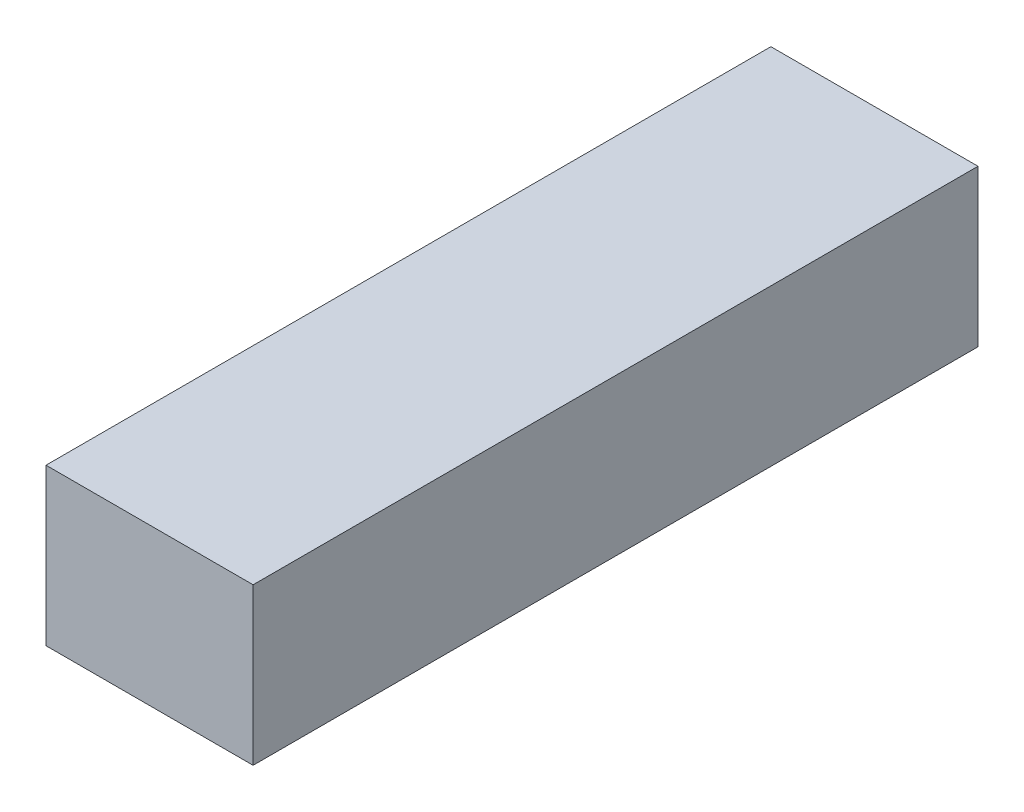
ISO-10303-21;
HEADER;
FILE_DESCRIPTION(('STEP AP214'),'2;1');
FILE_NAME('part.step','',(''),(''),'','','');
FILE_SCHEMA(('AUTOMOTIVE_DESIGN { 1 0 10303 214 1 1 1 1 }'));
ENDSEC;
DATA;
#1=APPLICATION_CONTEXT('core data for automotive mechanical design processes');
#2=APPLICATION_PROTOCOL_DEFINITION('international standard','automotive_design',2000,#1);
#3=PRODUCT_CONTEXT('',#1,'mechanical');
#4=PRODUCT('Part','Part','',(#3));
#5=PRODUCT_RELATED_PRODUCT_CATEGORY('part','',(#4));
#6=PRODUCT_DEFINITION_FORMATION('','',#4);
#7=PRODUCT_DEFINITION_CONTEXT('part definition',#1,'design');
#8=PRODUCT_DEFINITION('design','',#6,#7);
#9=PRODUCT_DEFINITION_SHAPE('','',#8);
#10=(LENGTH_UNIT() NAMED_UNIT(*) SI_UNIT(.MILLI.,.METRE.));
#11=(NAMED_UNIT(*) PLANE_ANGLE_UNIT() SI_UNIT($,.RADIAN.));
#12=(NAMED_UNIT(*) SI_UNIT($,.STERADIAN.) SOLID_ANGLE_UNIT());
#13=UNCERTAINTY_MEASURE_WITH_UNIT(LENGTH_MEASURE(1.E-05),#10,'distance_accuracy_value','');
#14=(GEOMETRIC_REPRESENTATION_CONTEXT(3) GLOBAL_UNCERTAINTY_ASSIGNED_CONTEXT((#13)) GLOBAL_UNIT_ASSIGNED_CONTEXT((#10,
#11,#12)) REPRESENTATION_CONTEXT('',''));
#15=CARTESIAN_POINT('',(0.,0.,0.));
#16=DIRECTION('',(0.,0.,1.));
#17=DIRECTION('',(1.,0.,0.));
#18=AXIS2_PLACEMENT_3D('',#15,#16,#17);
#19=CARTESIAN_POINT('',(0.,19.177,0.));
#20=DIRECTION('',(1.,0.,0.));
#21=DIRECTION('',(0.,0.,-1.));
#22=AXIS2_PLACEMENT_3D('',#19,#20,#21);
#23=PLANE('',#22);
#24=DIRECTION('',(0.,0.,1.));
#25=VECTOR('',#24,1.);
#26=CARTESIAN_POINT('',(0.,0.,0.));
#27=LINE('',#26,#25);
#28=CARTESIAN_POINT('',(0.,0.,-88.9));
#29=VERTEX_POINT('',#28);
#30=CARTESIAN_POINT('',(0.,0.,0.));
#31=VERTEX_POINT('',#30);
#32=EDGE_CURVE('E96',#29,#31,#27,.T.);
#33=ORIENTED_EDGE('',*,*,#32,.T.);
#34=DIRECTION('',(0.,-1.,0.));
#35=VECTOR('',#34,1.);
#36=CARTESIAN_POINT('',(0.,19.177,0.));
#37=LINE('',#36,#35);
#38=CARTESIAN_POINT('',(0.,19.177,0.));
#39=VERTEX_POINT('',#38);
#40=EDGE_CURVE('E11',#39,#31,#37,.T.);
#41=ORIENTED_EDGE('',*,*,#40,.F.);
#42=DIRECTION('',(0.,0.,1.));
#43=VECTOR('',#42,1.);
#44=CARTESIAN_POINT('',(0.,19.177,0.));
#45=LINE('',#44,#43);
#46=CARTESIAN_POINT('',(0.,19.177,-88.9));
#47=VERTEX_POINT('',#46);
#48=EDGE_CURVE('E84',#47,#39,#45,.T.);
#49=ORIENTED_EDGE('',*,*,#48,.F.);
#50=DIRECTION('',(0.,-1.,0.));
#51=VECTOR('',#50,1.);
#52=CARTESIAN_POINT('',(0.,19.177,-88.9));
#53=LINE('',#52,#51);
#54=EDGE_CURVE('E92',#47,#29,#53,.T.);
#55=ORIENTED_EDGE('',*,*,#54,.T.);
#56=EDGE_LOOP('',(#33,#41,#49,#55));
#57=FACE_BOUND('',#56,.T.);
#58=ADVANCED_FACE('F33',(#57),#23,.F.);
#59=CARTESIAN_POINT('',(0.,19.177,0.));
#60=DIRECTION('',(0.,0.,-1.));
#61=DIRECTION('',(-1.,0.,0.));
#62=AXIS2_PLACEMENT_3D('',#59,#60,#61);
#63=PLANE('',#62);
#64=DIRECTION('',(1.,0.,0.));
#65=VECTOR('',#64,1.);
#66=CARTESIAN_POINT('',(0.,0.,0.));
#67=LINE('',#66,#65);
#68=CARTESIAN_POINT('',(25.4,0.,0.));
#69=VERTEX_POINT('',#68);
#70=EDGE_CURVE('E88',#31,#69,#67,.T.);
#71=ORIENTED_EDGE('',*,*,#70,.T.);
#72=DIRECTION('',(0.,-1.,0.));
#73=VECTOR('',#72,1.);
#74=CARTESIAN_POINT('',(25.4,19.177,0.));
#75=LINE('',#74,#73);
#76=CARTESIAN_POINT('',(25.4,19.177,0.));
#77=VERTEX_POINT('',#76);
#78=EDGE_CURVE('E41',#77,#69,#75,.T.);
#79=ORIENTED_EDGE('',*,*,#78,.F.);
#80=DIRECTION('',(1.,0.,0.));
#81=VECTOR('',#80,1.);
#82=CARTESIAN_POINT('',(0.,19.177,0.));
#83=LINE('',#82,#81);
#84=EDGE_CURVE('E79',#39,#77,#83,.T.);
#85=ORIENTED_EDGE('',*,*,#84,.F.);
#86=ORIENTED_EDGE('',*,*,#40,.T.);
#87=EDGE_LOOP('',(#71,#79,#85,#86));
#88=FACE_BOUND('',#87,.T.);
#89=ADVANCED_FACE('F87',(#88),#63,.F.);
#90=CARTESIAN_POINT('',(25.4,19.177,-88.9));
#91=DIRECTION('',(-1.,0.,0.));
#92=DIRECTION('',(0.,0.,1.));
#93=AXIS2_PLACEMENT_3D('',#90,#91,#92);
#94=PLANE('',#93);
#95=DIRECTION('',(0.,0.,-1.));
#96=VECTOR('',#95,1.);
#97=CARTESIAN_POINT('',(25.4,0.,-88.9));
#98=LINE('',#97,#96);
#99=CARTESIAN_POINT('',(25.4,0.,-88.9));
#100=VERTEX_POINT('',#99);
#101=EDGE_CURVE('E66',#69,#100,#98,.T.);
#102=ORIENTED_EDGE('',*,*,#101,.T.);
#103=DIRECTION('',(0.,-1.,0.));
#104=VECTOR('',#103,1.);
#105=CARTESIAN_POINT('',(25.4,19.177,-88.9));
#106=LINE('',#105,#104);
#107=CARTESIAN_POINT('',(25.4,19.177,-88.9));
#108=VERTEX_POINT('',#107);
#109=EDGE_CURVE('E89',#108,#100,#106,.T.);
#110=ORIENTED_EDGE('',*,*,#109,.F.);
#111=DIRECTION('',(0.,0.,-1.));
#112=VECTOR('',#111,1.);
#113=CARTESIAN_POINT('',(25.4,19.177,-88.9));
#114=LINE('',#113,#112);
#115=EDGE_CURVE('E82',#77,#108,#114,.T.);
#116=ORIENTED_EDGE('',*,*,#115,.F.);
#117=ORIENTED_EDGE('',*,*,#78,.T.);
#118=EDGE_LOOP('',(#102,#110,#116,#117));
#119=FACE_BOUND('',#118,.T.);
#120=ADVANCED_FACE('F90',(#119),#94,.F.);
#121=CARTESIAN_POINT('',(0.,19.177,-88.9));
#122=DIRECTION('',(0.,0.,1.));
#123=DIRECTION('',(1.,0.,0.));
#124=AXIS2_PLACEMENT_3D('',#121,#122,#123);
#125=PLANE('',#124);
#126=DIRECTION('',(-1.,0.,0.));
#127=VECTOR('',#126,1.);
#128=CARTESIAN_POINT('',(0.,0.,-88.9));
#129=LINE('',#128,#127);
#130=EDGE_CURVE('E72',#100,#29,#129,.T.);
#131=ORIENTED_EDGE('',*,*,#130,.T.);
#132=ORIENTED_EDGE('',*,*,#54,.F.);
#133=DIRECTION('',(-1.,0.,0.));
#134=VECTOR('',#133,1.);
#135=CARTESIAN_POINT('',(0.,19.177,-88.9));
#136=LINE('',#135,#134);
#137=EDGE_CURVE('E49',#108,#47,#136,.T.);
#138=ORIENTED_EDGE('',*,*,#137,.F.);
#139=ORIENTED_EDGE('',*,*,#109,.T.);
#140=EDGE_LOOP('',(#131,#132,#138,#139));
#141=FACE_BOUND('',#140,.T.);
#142=ADVANCED_FACE('F103',(#141),#125,.F.);
#143=CARTESIAN_POINT('',(0.,19.177,0.));
#144=DIRECTION('',(0.,-1.,0.));
#145=DIRECTION('',(0.,0.,-1.));
#146=AXIS2_PLACEMENT_3D('',#143,#144,#145);
#147=PLANE('',#146);
#148=ORIENTED_EDGE('',*,*,#48,.T.);
#149=ORIENTED_EDGE('',*,*,#84,.T.);
#150=ORIENTED_EDGE('',*,*,#115,.T.);
#151=ORIENTED_EDGE('',*,*,#137,.T.);
#152=EDGE_LOOP('',(#148,#149,#150,#151));
#153=FACE_BOUND('',#152,.T.);
#154=ADVANCED_FACE('F80',(#153),#147,.F.);
#155=CARTESIAN_POINT('',(0.,0.,0.));
#156=DIRECTION('',(0.,-1.,0.));
#157=DIRECTION('',(0.,0.,-1.));
#158=AXIS2_PLACEMENT_3D('',#155,#156,#157);
#159=PLANE('',#158);
#160=ORIENTED_EDGE('',*,*,#32,.F.);
#161=ORIENTED_EDGE('',*,*,#130,.F.);
#162=ORIENTED_EDGE('',*,*,#101,.F.);
#163=ORIENTED_EDGE('',*,*,#70,.F.);
#164=EDGE_LOOP('',(#160,#161,#162,#163));
#165=FACE_BOUND('',#164,.T.);
#166=ADVANCED_FACE('F106',(#165),#159,.T.);
#167=CLOSED_SHELL('',(#58,#89,#120,#142,#154,#166));
#168=MANIFOLD_SOLID_BREP('B2',#167);
#169=ADVANCED_BREP_SHAPE_REPRESENTATION('',(#18,#168),#14);
#170=SHAPE_DEFINITION_REPRESENTATION(#9,#169);
ENDSEC;
END-ISO-10303-21;
